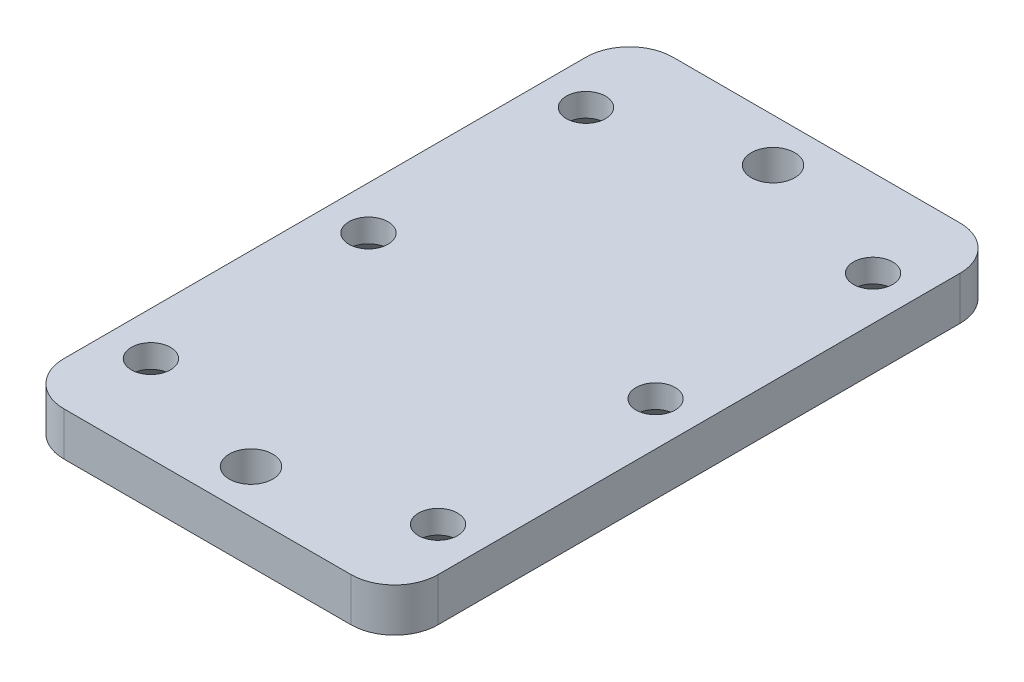
ISO-10303-21;
HEADER;
FILE_DESCRIPTION(('STEP AP214'),'2;1');
FILE_NAME('part.step','',(''),(''),'','','');
FILE_SCHEMA(('AUTOMOTIVE_DESIGN { 1 0 10303 214 1 1 1 1 }'));
ENDSEC;
DATA;
#1=APPLICATION_CONTEXT('core data for automotive mechanical design processes');
#2=APPLICATION_PROTOCOL_DEFINITION('international standard','automotive_design',2000,#1);
#3=PRODUCT_CONTEXT('',#1,'mechanical');
#4=PRODUCT('Part','Part','',(#3));
#5=PRODUCT_RELATED_PRODUCT_CATEGORY('part','',(#4));
#6=PRODUCT_DEFINITION_FORMATION('','',#4);
#7=PRODUCT_DEFINITION_CONTEXT('part definition',#1,'design');
#8=PRODUCT_DEFINITION('design','',#6,#7);
#9=PRODUCT_DEFINITION_SHAPE('','',#8);
#10=(LENGTH_UNIT() NAMED_UNIT(*) SI_UNIT(.MILLI.,.METRE.));
#11=(NAMED_UNIT(*) PLANE_ANGLE_UNIT() SI_UNIT($,.RADIAN.));
#12=(NAMED_UNIT(*) SI_UNIT($,.STERADIAN.) SOLID_ANGLE_UNIT());
#13=UNCERTAINTY_MEASURE_WITH_UNIT(LENGTH_MEASURE(1.E-05),#10,'distance_accuracy_value','');
#14=(GEOMETRIC_REPRESENTATION_CONTEXT(3) GLOBAL_UNCERTAINTY_ASSIGNED_CONTEXT((#13)) GLOBAL_UNIT_ASSIGNED_CONTEXT((#10,
#11,#12)) REPRESENTATION_CONTEXT('',''));
#15=CARTESIAN_POINT('',(0.,0.,0.));
#16=DIRECTION('',(0.,0.,1.));
#17=DIRECTION('',(1.,0.,0.));
#18=AXIS2_PLACEMENT_3D('',#15,#16,#17);
#19=CARTESIAN_POINT('',(-16.5,5.,30.));
#20=DIRECTION('',(0.,-1.,0.));
#21=DIRECTION('',(0.,0.,-1.));
#22=AXIS2_PLACEMENT_3D('',#19,#20,#21);
#23=PLANE('',#22);
#24=CARTESIAN_POINT('',(16.5,5.,-25.));
#25=DIRECTION('',(0.,-1.,0.));
#26=DIRECTION('',(0.,0.,-1.));
#27=AXIS2_PLACEMENT_3D('',#24,#25,#26);
#28=CIRCLE('',#27,2.25);
#29=CARTESIAN_POINT('',(16.5,5.,-27.25));
#30=VERTEX_POINT('',#29);
#31=EDGE_CURVE('E257',#30,#30,#28,.T.);
#32=ORIENTED_EDGE('',*,*,#31,.T.);
#33=EDGE_LOOP('',(#32));
#34=FACE_BOUND('',#33,.T.);
#35=CARTESIAN_POINT('',(16.5,5.,0.));
#36=DIRECTION('',(0.,-1.,0.));
#37=DIRECTION('',(0.,0.,-1.));
#38=AXIS2_PLACEMENT_3D('',#35,#36,#37);
#39=CIRCLE('',#38,2.25);
#40=CARTESIAN_POINT('',(16.5,5.,-2.25));
#41=VERTEX_POINT('',#40);
#42=EDGE_CURVE('E248',#41,#41,#39,.T.);
#43=ORIENTED_EDGE('',*,*,#42,.T.);
#44=EDGE_LOOP('',(#43));
#45=FACE_BOUND('',#44,.T.);
#46=CARTESIAN_POINT('',(16.5,5.,25.));
#47=DIRECTION('',(0.,-1.,0.));
#48=DIRECTION('',(0.,0.,-1.));
#49=AXIS2_PLACEMENT_3D('',#46,#47,#48);
#50=CIRCLE('',#49,2.25);
#51=CARTESIAN_POINT('',(16.5,5.,22.75));
#52=VERTEX_POINT('',#51);
#53=EDGE_CURVE('E239',#52,#52,#50,.T.);
#54=ORIENTED_EDGE('',*,*,#53,.T.);
#55=EDGE_LOOP('',(#54));
#56=FACE_BOUND('',#55,.T.);
#57=CARTESIAN_POINT('',(-16.5,5.,25.));
#58=DIRECTION('',(0.,-1.,0.));
#59=DIRECTION('',(0.,0.,-1.));
#60=AXIS2_PLACEMENT_3D('',#57,#58,#59);
#61=CIRCLE('',#60,2.25);
#62=CARTESIAN_POINT('',(-16.5,5.,22.75));
#63=VERTEX_POINT('',#62);
#64=EDGE_CURVE('E230',#63,#63,#61,.T.);
#65=ORIENTED_EDGE('',*,*,#64,.T.);
#66=EDGE_LOOP('',(#65));
#67=FACE_BOUND('',#66,.T.);
#68=CARTESIAN_POINT('',(-16.5,5.,0.));
#69=DIRECTION('',(0.,-1.,0.));
#70=DIRECTION('',(0.,0.,-1.));
#71=AXIS2_PLACEMENT_3D('',#68,#69,#70);
#72=CIRCLE('',#71,2.25);
#73=CARTESIAN_POINT('',(-16.5,5.,-2.25));
#74=VERTEX_POINT('',#73);
#75=EDGE_CURVE('E221',#74,#74,#72,.T.);
#76=ORIENTED_EDGE('',*,*,#75,.T.);
#77=EDGE_LOOP('',(#76));
#78=FACE_BOUND('',#77,.T.);
#79=CARTESIAN_POINT('',(-16.5,5.,-25.));
#80=DIRECTION('',(0.,-1.,0.));
#81=DIRECTION('',(0.,0.,-1.));
#82=AXIS2_PLACEMENT_3D('',#79,#80,#81);
#83=CIRCLE('',#82,2.25);
#84=CARTESIAN_POINT('',(-16.5,5.,-27.25));
#85=VERTEX_POINT('',#84);
#86=EDGE_CURVE('E212',#85,#85,#83,.T.);
#87=ORIENTED_EDGE('',*,*,#86,.T.);
#88=EDGE_LOOP('',(#87));
#89=FACE_BOUND('',#88,.T.);
#90=CARTESIAN_POINT('',(0.,5.,-30.));
#91=DIRECTION('',(0.,-1.,0.));
#92=DIRECTION('',(0.,0.,-1.));
#93=AXIS2_PLACEMENT_3D('',#90,#91,#92);
#94=CIRCLE('',#93,2.5);
#95=CARTESIAN_POINT('',(0.,5.,-32.5));
#96=VERTEX_POINT('',#95);
#97=EDGE_CURVE('E203',#96,#96,#94,.T.);
#98=ORIENTED_EDGE('',*,*,#97,.T.);
#99=EDGE_LOOP('',(#98));
#100=FACE_BOUND('',#99,.T.);
#101=CARTESIAN_POINT('',(0.,5.,30.));
#102=DIRECTION('',(0.,-1.,0.));
#103=DIRECTION('',(0.,0.,-1.));
#104=AXIS2_PLACEMENT_3D('',#101,#102,#103);
#105=CIRCLE('',#104,2.5);
#106=CARTESIAN_POINT('',(0.,5.,27.5));
#107=VERTEX_POINT('',#106);
#108=EDGE_CURVE('E151',#107,#107,#105,.T.);
#109=ORIENTED_EDGE('',*,*,#108,.T.);
#110=EDGE_LOOP('',(#109));
#111=FACE_BOUND('',#110,.T.);
#112=CARTESIAN_POINT('',(-16.5,5.,30.));
#113=DIRECTION('',(0.,1.,0.));
#114=DIRECTION('',(0.,0.,-1.));
#115=AXIS2_PLACEMENT_3D('',#112,#113,#114);
#116=CIRCLE('',#115,5.);
#117=CARTESIAN_POINT('',(-21.5,5.,30.));
#118=VERTEX_POINT('',#117);
#119=CARTESIAN_POINT('',(-16.5,5.,35.));
#120=VERTEX_POINT('',#119);
#121=EDGE_CURVE('E162',#118,#120,#116,.T.);
#122=ORIENTED_EDGE('',*,*,#121,.T.);
#123=DIRECTION('',(1.,0.,0.));
#124=VECTOR('',#123,1.);
#125=CARTESIAN_POINT('',(-16.5,5.,35.));
#126=LINE('',#125,#124);
#127=CARTESIAN_POINT('',(16.5,5.,35.));
#128=VERTEX_POINT('',#127);
#129=EDGE_CURVE('E111',#120,#128,#126,.T.);
#130=ORIENTED_EDGE('',*,*,#129,.T.);
#131=CARTESIAN_POINT('',(16.5,5.,30.));
#132=DIRECTION('',(0.,1.,0.));
#133=DIRECTION('',(0.,0.,1.));
#134=AXIS2_PLACEMENT_3D('',#131,#132,#133);
#135=CIRCLE('',#134,5.);
#136=CARTESIAN_POINT('',(21.5,5.,30.));
#137=VERTEX_POINT('',#136);
#138=EDGE_CURVE('E177',#128,#137,#135,.T.);
#139=ORIENTED_EDGE('',*,*,#138,.T.);
#140=DIRECTION('',(0.,0.,-1.));
#141=VECTOR('',#140,1.);
#142=CARTESIAN_POINT('',(21.5,5.,30.));
#143=LINE('',#142,#141);
#144=CARTESIAN_POINT('',(21.5,5.,-30.));
#145=VERTEX_POINT('',#144);
#146=EDGE_CURVE('E189',#137,#145,#143,.T.);
#147=ORIENTED_EDGE('',*,*,#146,.T.);
#148=CARTESIAN_POINT('',(16.5,5.,-30.));
#149=DIRECTION('',(0.,1.,0.));
#150=DIRECTION('',(0.,0.,-1.));
#151=AXIS2_PLACEMENT_3D('',#148,#149,#150);
#152=CIRCLE('',#151,5.);
#153=CARTESIAN_POINT('',(16.5,5.,-35.));
#154=VERTEX_POINT('',#153);
#155=EDGE_CURVE('E129',#145,#154,#152,.T.);
#156=ORIENTED_EDGE('',*,*,#155,.T.);
#157=DIRECTION('',(-1.,0.,0.));
#158=VECTOR('',#157,1.);
#159=CARTESIAN_POINT('',(-16.5,5.,-35.));
#160=LINE('',#159,#158);
#161=CARTESIAN_POINT('',(-16.5,5.,-35.));
#162=VERTEX_POINT('',#161);
#163=EDGE_CURVE('E124',#154,#162,#160,.T.);
#164=ORIENTED_EDGE('',*,*,#163,.T.);
#165=CARTESIAN_POINT('',(-16.5,5.,-30.));
#166=DIRECTION('',(0.,1.,0.));
#167=DIRECTION('',(0.,0.,-1.));
#168=AXIS2_PLACEMENT_3D('',#165,#166,#167);
#169=CIRCLE('',#168,5.);
#170=CARTESIAN_POINT('',(-21.5,5.,-30.));
#171=VERTEX_POINT('',#170);
#172=EDGE_CURVE('E127',#162,#171,#169,.T.);
#173=ORIENTED_EDGE('',*,*,#172,.T.);
#174=DIRECTION('',(0.,0.,1.));
#175=VECTOR('',#174,1.);
#176=CARTESIAN_POINT('',(-21.5,5.,30.));
#177=LINE('',#176,#175);
#178=EDGE_CURVE('E68',#171,#118,#177,.T.);
#179=ORIENTED_EDGE('',*,*,#178,.T.);
#180=EDGE_LOOP('',(#122,#130,#139,#147,#156,#164,#173,#179));
#181=FACE_BOUND('',#180,.T.);
#182=ADVANCED_FACE('F51',(#34,#45,#56,#67,#78,#89,#100,#111,#181),#23,.F.);
#183=CARTESIAN_POINT('',(-16.5,0.,30.));
#184=DIRECTION('',(0.,-1.,0.));
#185=DIRECTION('',(0.,0.,-1.));
#186=AXIS2_PLACEMENT_3D('',#183,#184,#185);
#187=PLANE('',#186);
#188=CARTESIAN_POINT('',(16.5,0.,-25.));
#189=DIRECTION('',(0.,-1.,0.));
#190=DIRECTION('',(0.,0.,-1.));
#191=AXIS2_PLACEMENT_3D('',#188,#189,#190);
#192=CIRCLE('',#191,4.59);
#193=CARTESIAN_POINT('',(16.5,0.,-29.59));
#194=VERTEX_POINT('',#193);
#195=EDGE_CURVE('E263',#194,#194,#192,.T.);
#196=ORIENTED_EDGE('',*,*,#195,.F.);
#197=EDGE_LOOP('',(#196));
#198=FACE_BOUND('',#197,.T.);
#199=CARTESIAN_POINT('',(16.5,0.,0.));
#200=DIRECTION('',(0.,-1.,0.));
#201=DIRECTION('',(0.,0.,-1.));
#202=AXIS2_PLACEMENT_3D('',#199,#200,#201);
#203=CIRCLE('',#202,4.59);
#204=CARTESIAN_POINT('',(16.5,0.,-4.59));
#205=VERTEX_POINT('',#204);
#206=EDGE_CURVE('E254',#205,#205,#203,.T.);
#207=ORIENTED_EDGE('',*,*,#206,.F.);
#208=EDGE_LOOP('',(#207));
#209=FACE_BOUND('',#208,.T.);
#210=CARTESIAN_POINT('',(16.5,0.,25.));
#211=DIRECTION('',(0.,-1.,0.));
#212=DIRECTION('',(0.,0.,-1.));
#213=AXIS2_PLACEMENT_3D('',#210,#211,#212);
#214=CIRCLE('',#213,4.59);
#215=CARTESIAN_POINT('',(16.5,0.,20.41));
#216=VERTEX_POINT('',#215);
#217=EDGE_CURVE('E245',#216,#216,#214,.T.);
#218=ORIENTED_EDGE('',*,*,#217,.F.);
#219=EDGE_LOOP('',(#218));
#220=FACE_BOUND('',#219,.T.);
#221=CARTESIAN_POINT('',(-16.5,0.,25.));
#222=DIRECTION('',(0.,-1.,0.));
#223=DIRECTION('',(0.,0.,-1.));
#224=AXIS2_PLACEMENT_3D('',#221,#222,#223);
#225=CIRCLE('',#224,4.59);
#226=CARTESIAN_POINT('',(-16.5,0.,20.41));
#227=VERTEX_POINT('',#226);
#228=EDGE_CURVE('E236',#227,#227,#225,.T.);
#229=ORIENTED_EDGE('',*,*,#228,.F.);
#230=EDGE_LOOP('',(#229));
#231=FACE_BOUND('',#230,.T.);
#232=CARTESIAN_POINT('',(-16.5,0.,0.));
#233=DIRECTION('',(0.,-1.,0.));
#234=DIRECTION('',(0.,0.,-1.));
#235=AXIS2_PLACEMENT_3D('',#232,#233,#234);
#236=CIRCLE('',#235,4.59);
#237=CARTESIAN_POINT('',(-16.5,0.,-4.59));
#238=VERTEX_POINT('',#237);
#239=EDGE_CURVE('E227',#238,#238,#236,.T.);
#240=ORIENTED_EDGE('',*,*,#239,.F.);
#241=EDGE_LOOP('',(#240));
#242=FACE_BOUND('',#241,.T.);
#243=CARTESIAN_POINT('',(-16.5,0.,-25.));
#244=DIRECTION('',(0.,-1.,0.));
#245=DIRECTION('',(0.,0.,-1.));
#246=AXIS2_PLACEMENT_3D('',#243,#244,#245);
#247=CIRCLE('',#246,4.59);
#248=CARTESIAN_POINT('',(-16.5,0.,-29.59));
#249=VERTEX_POINT('',#248);
#250=EDGE_CURVE('E218',#249,#249,#247,.T.);
#251=ORIENTED_EDGE('',*,*,#250,.F.);
#252=EDGE_LOOP('',(#251));
#253=FACE_BOUND('',#252,.T.);
#254=CARTESIAN_POINT('',(0.,0.,-30.));
#255=DIRECTION('',(0.,-1.,0.));
#256=DIRECTION('',(0.,0.,-1.));
#257=AXIS2_PLACEMENT_3D('',#254,#255,#256);
#258=CIRCLE('',#257,3.5);
#259=CARTESIAN_POINT('',(0.,0.,-33.5));
#260=VERTEX_POINT('',#259);
#261=EDGE_CURVE('E209',#260,#260,#258,.T.);
#262=ORIENTED_EDGE('',*,*,#261,.F.);
#263=EDGE_LOOP('',(#262));
#264=FACE_BOUND('',#263,.T.);
#265=CARTESIAN_POINT('',(0.,0.,30.));
#266=DIRECTION('',(0.,-1.,0.));
#267=DIRECTION('',(0.,0.,-1.));
#268=AXIS2_PLACEMENT_3D('',#265,#266,#267);
#269=CIRCLE('',#268,3.5);
#270=CARTESIAN_POINT('',(0.,0.,26.5));
#271=VERTEX_POINT('',#270);
#272=EDGE_CURVE('E200',#271,#271,#269,.T.);
#273=ORIENTED_EDGE('',*,*,#272,.F.);
#274=EDGE_LOOP('',(#273));
#275=FACE_BOUND('',#274,.T.);
#276=CARTESIAN_POINT('',(-16.5,0.,30.));
#277=DIRECTION('',(0.,1.,0.));
#278=DIRECTION('',(0.,0.,-1.));
#279=AXIS2_PLACEMENT_3D('',#276,#277,#278);
#280=CIRCLE('',#279,5.);
#281=CARTESIAN_POINT('',(-21.5,0.,30.));
#282=VERTEX_POINT('',#281);
#283=CARTESIAN_POINT('',(-16.5,0.,35.));
#284=VERTEX_POINT('',#283);
#285=EDGE_CURVE('E147',#282,#284,#280,.T.);
#286=ORIENTED_EDGE('',*,*,#285,.F.);
#287=DIRECTION('',(0.,0.,1.));
#288=VECTOR('',#287,1.);
#289=CARTESIAN_POINT('',(-21.5,0.,30.));
#290=LINE('',#289,#288);
#291=CARTESIAN_POINT('',(-21.5,0.,-30.));
#292=VERTEX_POINT('',#291);
#293=EDGE_CURVE('E103',#292,#282,#290,.T.);
#294=ORIENTED_EDGE('',*,*,#293,.F.);
#295=CARTESIAN_POINT('',(-16.5,0.,-30.));
#296=DIRECTION('',(0.,1.,0.));
#297=DIRECTION('',(0.,0.,-1.));
#298=AXIS2_PLACEMENT_3D('',#295,#296,#297);
#299=CIRCLE('',#298,5.);
#300=CARTESIAN_POINT('',(-16.5,0.,-35.));
#301=VERTEX_POINT('',#300);
#302=EDGE_CURVE('E97',#301,#292,#299,.T.);
#303=ORIENTED_EDGE('',*,*,#302,.F.);
#304=DIRECTION('',(-1.,0.,0.));
#305=VECTOR('',#304,1.);
#306=CARTESIAN_POINT('',(-16.5,0.,-35.));
#307=LINE('',#306,#305);
#308=CARTESIAN_POINT('',(16.5,0.,-35.));
#309=VERTEX_POINT('',#308);
#310=EDGE_CURVE('E137',#309,#301,#307,.T.);
#311=ORIENTED_EDGE('',*,*,#310,.F.);
#312=CARTESIAN_POINT('',(16.5,0.,-30.));
#313=DIRECTION('',(0.,1.,0.));
#314=DIRECTION('',(0.,0.,-1.));
#315=AXIS2_PLACEMENT_3D('',#312,#313,#314);
#316=CIRCLE('',#315,5.);
#317=CARTESIAN_POINT('',(21.5,0.,-30.));
#318=VERTEX_POINT('',#317);
#319=EDGE_CURVE('E157',#318,#309,#316,.T.);
#320=ORIENTED_EDGE('',*,*,#319,.F.);
#321=DIRECTION('',(0.,0.,-1.));
#322=VECTOR('',#321,1.);
#323=CARTESIAN_POINT('',(21.5,0.,30.));
#324=LINE('',#323,#322);
#325=CARTESIAN_POINT('',(21.5,0.,30.));
#326=VERTEX_POINT('',#325);
#327=EDGE_CURVE('E155',#326,#318,#324,.T.);
#328=ORIENTED_EDGE('',*,*,#327,.F.);
#329=CARTESIAN_POINT('',(16.5,0.,30.));
#330=DIRECTION('',(0.,1.,0.));
#331=DIRECTION('',(0.,0.,1.));
#332=AXIS2_PLACEMENT_3D('',#329,#330,#331);
#333=CIRCLE('',#332,5.);
#334=CARTESIAN_POINT('',(16.5,0.,35.));
#335=VERTEX_POINT('',#334);
#336=EDGE_CURVE('E153',#335,#326,#333,.T.);
#337=ORIENTED_EDGE('',*,*,#336,.F.);
#338=DIRECTION('',(1.,0.,0.));
#339=VECTOR('',#338,1.);
#340=CARTESIAN_POINT('',(-16.5,0.,35.));
#341=LINE('',#340,#339);
#342=EDGE_CURVE('E150',#284,#335,#341,.T.);
#343=ORIENTED_EDGE('',*,*,#342,.F.);
#344=EDGE_LOOP('',(#286,#294,#303,#311,#320,#328,#337,#343));
#345=FACE_BOUND('',#344,.T.);
#346=ADVANCED_FACE('F181',(#198,#209,#220,#231,#242,#253,#264,#275,#345),#187,.T.);
#347=CARTESIAN_POINT('',(-16.5,5.,30.));
#348=DIRECTION('',(0.,-1.,0.));
#349=DIRECTION('',(0.,0.,-1.));
#350=AXIS2_PLACEMENT_3D('',#347,#348,#349);
#351=CYLINDRICAL_SURFACE('',#350,5.);
#352=ORIENTED_EDGE('',*,*,#285,.T.);
#353=DIRECTION('',(0.,-1.,0.));
#354=VECTOR('',#353,1.);
#355=CARTESIAN_POINT('',(-16.5,5.,35.));
#356=LINE('',#355,#354);
#357=EDGE_CURVE('E11',#120,#284,#356,.T.);
#358=ORIENTED_EDGE('',*,*,#357,.F.);
#359=ORIENTED_EDGE('',*,*,#121,.F.);
#360=DIRECTION('',(0.,-1.,0.));
#361=VECTOR('',#360,1.);
#362=CARTESIAN_POINT('',(-21.5,5.,30.));
#363=LINE('',#362,#361);
#364=EDGE_CURVE('E143',#118,#282,#363,.T.);
#365=ORIENTED_EDGE('',*,*,#364,.T.);
#366=EDGE_LOOP('',(#352,#358,#359,#365));
#367=FACE_BOUND('',#366,.T.);
#368=ADVANCED_FACE('F53',(#367),#351,.T.);
#369=CARTESIAN_POINT('',(-16.5,5.,35.));
#370=DIRECTION('',(0.,0.,-1.));
#371=DIRECTION('',(-1.,0.,0.));
#372=AXIS2_PLACEMENT_3D('',#369,#370,#371);
#373=PLANE('',#372);
#374=ORIENTED_EDGE('',*,*,#342,.T.);
#375=DIRECTION('',(0.,-1.,0.));
#376=VECTOR('',#375,1.);
#377=CARTESIAN_POINT('',(16.5,5.,35.));
#378=LINE('',#377,#376);
#379=EDGE_CURVE('E60',#128,#335,#378,.T.);
#380=ORIENTED_EDGE('',*,*,#379,.F.);
#381=ORIENTED_EDGE('',*,*,#129,.F.);
#382=ORIENTED_EDGE('',*,*,#357,.T.);
#383=EDGE_LOOP('',(#374,#380,#381,#382));
#384=FACE_BOUND('',#383,.T.);
#385=ADVANCED_FACE('F323',(#384),#373,.F.);
#386=CARTESIAN_POINT('',(16.5,5.,30.));
#387=DIRECTION('',(0.,-1.,0.));
#388=DIRECTION('',(0.,0.,-1.));
#389=AXIS2_PLACEMENT_3D('',#386,#387,#388);
#390=CYLINDRICAL_SURFACE('',#389,5.);
#391=ORIENTED_EDGE('',*,*,#336,.T.);
#392=DIRECTION('',(0.,-1.,0.));
#393=VECTOR('',#392,1.);
#394=CARTESIAN_POINT('',(21.5,5.,30.));
#395=LINE('',#394,#393);
#396=EDGE_CURVE('E169',#137,#326,#395,.T.);
#397=ORIENTED_EDGE('',*,*,#396,.F.);
#398=ORIENTED_EDGE('',*,*,#138,.F.);
#399=ORIENTED_EDGE('',*,*,#379,.T.);
#400=EDGE_LOOP('',(#391,#397,#398,#399));
#401=FACE_BOUND('',#400,.T.);
#402=ADVANCED_FACE('F175',(#401),#390,.T.);
#403=CARTESIAN_POINT('',(21.5,5.,30.));
#404=DIRECTION('',(-1.,0.,0.));
#405=DIRECTION('',(0.,0.,1.));
#406=AXIS2_PLACEMENT_3D('',#403,#404,#405);
#407=PLANE('',#406);
#408=ORIENTED_EDGE('',*,*,#327,.T.);
#409=DIRECTION('',(0.,-1.,0.));
#410=VECTOR('',#409,1.);
#411=CARTESIAN_POINT('',(21.5,5.,-30.));
#412=LINE('',#411,#410);
#413=EDGE_CURVE('E166',#145,#318,#412,.T.);
#414=ORIENTED_EDGE('',*,*,#413,.F.);
#415=ORIENTED_EDGE('',*,*,#146,.F.);
#416=ORIENTED_EDGE('',*,*,#396,.T.);
#417=EDGE_LOOP('',(#408,#414,#415,#416));
#418=FACE_BOUND('',#417,.T.);
#419=ADVANCED_FACE('F185',(#418),#407,.F.);
#420=CARTESIAN_POINT('',(16.5,5.,-30.));
#421=DIRECTION('',(0.,-1.,0.));
#422=DIRECTION('',(0.,0.,-1.));
#423=AXIS2_PLACEMENT_3D('',#420,#421,#422);
#424=CYLINDRICAL_SURFACE('',#423,5.);
#425=ORIENTED_EDGE('',*,*,#319,.T.);
#426=DIRECTION('',(0.,-1.,0.));
#427=VECTOR('',#426,1.);
#428=CARTESIAN_POINT('',(16.5,5.,-35.));
#429=LINE('',#428,#427);
#430=EDGE_CURVE('E138',#154,#309,#429,.T.);
#431=ORIENTED_EDGE('',*,*,#430,.F.);
#432=ORIENTED_EDGE('',*,*,#155,.F.);
#433=ORIENTED_EDGE('',*,*,#413,.T.);
#434=EDGE_LOOP('',(#425,#431,#432,#433));
#435=FACE_BOUND('',#434,.T.);
#436=ADVANCED_FACE('F188',(#435),#424,.T.);
#437=CARTESIAN_POINT('',(-16.5,5.,-35.));
#438=DIRECTION('',(0.,0.,1.));
#439=DIRECTION('',(1.,0.,0.));
#440=AXIS2_PLACEMENT_3D('',#437,#438,#439);
#441=PLANE('',#440);
#442=ORIENTED_EDGE('',*,*,#310,.T.);
#443=DIRECTION('',(0.,-1.,0.));
#444=VECTOR('',#443,1.);
#445=CARTESIAN_POINT('',(-16.5,5.,-35.));
#446=LINE('',#445,#444);
#447=EDGE_CURVE('E134',#162,#301,#446,.T.);
#448=ORIENTED_EDGE('',*,*,#447,.F.);
#449=ORIENTED_EDGE('',*,*,#163,.F.);
#450=ORIENTED_EDGE('',*,*,#430,.T.);
#451=EDGE_LOOP('',(#442,#448,#449,#450));
#452=FACE_BOUND('',#451,.T.);
#453=ADVANCED_FACE('F135',(#452),#441,.F.);
#454=CARTESIAN_POINT('',(-16.5,5.,-30.));
#455=DIRECTION('',(0.,-1.,0.));
#456=DIRECTION('',(0.,0.,-1.));
#457=AXIS2_PLACEMENT_3D('',#454,#455,#456);
#458=CYLINDRICAL_SURFACE('',#457,5.);
#459=ORIENTED_EDGE('',*,*,#302,.T.);
#460=DIRECTION('',(0.,-1.,0.));
#461=VECTOR('',#460,1.);
#462=CARTESIAN_POINT('',(-21.5,5.,-30.));
#463=LINE('',#462,#461);
#464=EDGE_CURVE('E139',#171,#292,#463,.T.);
#465=ORIENTED_EDGE('',*,*,#464,.F.);
#466=ORIENTED_EDGE('',*,*,#172,.F.);
#467=ORIENTED_EDGE('',*,*,#447,.T.);
#468=EDGE_LOOP('',(#459,#465,#466,#467));
#469=FACE_BOUND('',#468,.T.);
#470=ADVANCED_FACE('F141',(#469),#458,.T.);
#471=CARTESIAN_POINT('',(-21.5,5.,30.));
#472=DIRECTION('',(1.,0.,0.));
#473=DIRECTION('',(0.,0.,-1.));
#474=AXIS2_PLACEMENT_3D('',#471,#472,#473);
#475=PLANE('',#474);
#476=ORIENTED_EDGE('',*,*,#293,.T.);
#477=ORIENTED_EDGE('',*,*,#364,.F.);
#478=ORIENTED_EDGE('',*,*,#178,.F.);
#479=ORIENTED_EDGE('',*,*,#464,.T.);
#480=EDGE_LOOP('',(#476,#477,#478,#479));
#481=FACE_BOUND('',#480,.T.);
#482=ADVANCED_FACE('F300',(#481),#475,.F.);
#483=CARTESIAN_POINT('',(0.,0.,30.));
#484=DIRECTION('',(0.,-1.,0.));
#485=DIRECTION('',(0.,0.,-1.));
#486=AXIS2_PLACEMENT_3D('',#483,#484,#485);
#487=CYLINDRICAL_SURFACE('',#486,2.5);
#488=ORIENTED_EDGE('',*,*,#108,.F.);
#489=EDGE_LOOP('',(#488));
#490=FACE_BOUND('',#489,.T.);
#491=CARTESIAN_POINT('',(0.,0.999999999999999,30.));
#492=DIRECTION('',(0.,-1.,0.));
#493=DIRECTION('',(0.,0.,-1.));
#494=AXIS2_PLACEMENT_3D('',#491,#492,#493);
#495=CIRCLE('',#494,2.5);
#496=CARTESIAN_POINT('',(0.,0.999999999999999,27.5));
#497=VERTEX_POINT('',#496);
#498=EDGE_CURVE('E197',#497,#497,#495,.T.);
#499=ORIENTED_EDGE('',*,*,#498,.T.);
#500=EDGE_LOOP('',(#499));
#501=FACE_BOUND('',#500,.T.);
#502=ADVANCED_FACE('F289',(#490,#501),#487,.F.);
#503=CARTESIAN_POINT('',(0.,0.,30.));
#504=DIRECTION('',(0.,-1.,0.));
#505=DIRECTION('',(0.,0.,-1.));
#506=AXIS2_PLACEMENT_3D('',#503,#504,#505);
#507=CONICAL_SURFACE('',#506,3.5,0.785398163397449);
#508=ORIENTED_EDGE('',*,*,#498,.F.);
#509=EDGE_LOOP('',(#508));
#510=FACE_BOUND('',#509,.T.);
#511=ORIENTED_EDGE('',*,*,#272,.T.);
#512=EDGE_LOOP('',(#511));
#513=FACE_BOUND('',#512,.T.);
#514=ADVANCED_FACE('F286',(#510,#513),#507,.F.);
#515=CARTESIAN_POINT('',(0.,0.,-30.));
#516=DIRECTION('',(0.,-1.,0.));
#517=DIRECTION('',(0.,0.,-1.));
#518=AXIS2_PLACEMENT_3D('',#515,#516,#517);
#519=CYLINDRICAL_SURFACE('',#518,2.5);
#520=ORIENTED_EDGE('',*,*,#97,.F.);
#521=EDGE_LOOP('',(#520));
#522=FACE_BOUND('',#521,.T.);
#523=CARTESIAN_POINT('',(0.,0.999999999999999,-30.));
#524=DIRECTION('',(0.,-1.,0.));
#525=DIRECTION('',(0.,0.,-1.));
#526=AXIS2_PLACEMENT_3D('',#523,#524,#525);
#527=CIRCLE('',#526,2.5);
#528=CARTESIAN_POINT('',(0.,0.999999999999999,-32.5));
#529=VERTEX_POINT('',#528);
#530=EDGE_CURVE('E206',#529,#529,#527,.T.);
#531=ORIENTED_EDGE('',*,*,#530,.T.);
#532=EDGE_LOOP('',(#531));
#533=FACE_BOUND('',#532,.T.);
#534=ADVANCED_FACE('F288',(#522,#533),#519,.F.);
#535=CARTESIAN_POINT('',(0.,0.,-30.));
#536=DIRECTION('',(0.,-1.,0.));
#537=DIRECTION('',(0.,0.,-1.));
#538=AXIS2_PLACEMENT_3D('',#535,#536,#537);
#539=CONICAL_SURFACE('',#538,3.5,0.785398163397449);
#540=ORIENTED_EDGE('',*,*,#530,.F.);
#541=EDGE_LOOP('',(#540));
#542=FACE_BOUND('',#541,.T.);
#543=ORIENTED_EDGE('',*,*,#261,.T.);
#544=EDGE_LOOP('',(#543));
#545=FACE_BOUND('',#544,.T.);
#546=ADVANCED_FACE('F296',(#542,#545),#539,.F.);
#547=CARTESIAN_POINT('',(-16.5,0.,-25.));
#548=DIRECTION('',(0.,-1.,0.));
#549=DIRECTION('',(0.,0.,-1.));
#550=AXIS2_PLACEMENT_3D('',#547,#548,#549);
#551=CYLINDRICAL_SURFACE('',#550,2.25);
#552=ORIENTED_EDGE('',*,*,#86,.F.);
#553=EDGE_LOOP('',(#552));
#554=FACE_BOUND('',#553,.T.);
#555=CARTESIAN_POINT('',(-16.5,2.34,-25.));
#556=DIRECTION('',(0.,-1.,0.));
#557=DIRECTION('',(0.,0.,-1.));
#558=AXIS2_PLACEMENT_3D('',#555,#556,#557);
#559=CIRCLE('',#558,2.25);
#560=CARTESIAN_POINT('',(-16.5,2.34,-27.25));
#561=VERTEX_POINT('',#560);
#562=EDGE_CURVE('E215',#561,#561,#559,.T.);
#563=ORIENTED_EDGE('',*,*,#562,.T.);
#564=EDGE_LOOP('',(#563));
#565=FACE_BOUND('',#564,.T.);
#566=ADVANCED_FACE('F409',(#554,#565),#551,.F.);
#567=CARTESIAN_POINT('',(-16.5,0.,-25.));
#568=DIRECTION('',(0.,-1.,0.));
#569=DIRECTION('',(0.,0.,-1.));
#570=AXIS2_PLACEMENT_3D('',#567,#568,#569);
#571=CONICAL_SURFACE('',#570,4.59,0.785398163397448);
#572=ORIENTED_EDGE('',*,*,#562,.F.);
#573=EDGE_LOOP('',(#572));
#574=FACE_BOUND('',#573,.T.);
#575=ORIENTED_EDGE('',*,*,#250,.T.);
#576=EDGE_LOOP('',(#575));
#577=FACE_BOUND('',#576,.T.);
#578=ADVANCED_FACE('F420',(#574,#577),#571,.F.);
#579=CARTESIAN_POINT('',(-16.5,0.,0.));
#580=DIRECTION('',(0.,-1.,0.));
#581=DIRECTION('',(0.,0.,-1.));
#582=AXIS2_PLACEMENT_3D('',#579,#580,#581);
#583=CYLINDRICAL_SURFACE('',#582,2.25);
#584=ORIENTED_EDGE('',*,*,#75,.F.);
#585=EDGE_LOOP('',(#584));
#586=FACE_BOUND('',#585,.T.);
#587=CARTESIAN_POINT('',(-16.5,2.34,0.));
#588=DIRECTION('',(0.,-1.,0.));
#589=DIRECTION('',(0.,0.,-1.));
#590=AXIS2_PLACEMENT_3D('',#587,#588,#589);
#591=CIRCLE('',#590,2.25);
#592=CARTESIAN_POINT('',(-16.5,2.34,-2.25));
#593=VERTEX_POINT('',#592);
#594=EDGE_CURVE('E224',#593,#593,#591,.T.);
#595=ORIENTED_EDGE('',*,*,#594,.T.);
#596=EDGE_LOOP('',(#595));
#597=FACE_BOUND('',#596,.T.);
#598=ADVANCED_FACE('F430',(#586,#597),#583,.F.);
#599=CARTESIAN_POINT('',(-16.5,0.,0.));
#600=DIRECTION('',(0.,-1.,0.));
#601=DIRECTION('',(0.,0.,-1.));
#602=AXIS2_PLACEMENT_3D('',#599,#600,#601);
#603=CONICAL_SURFACE('',#602,4.59,0.785398163397448);
#604=ORIENTED_EDGE('',*,*,#594,.F.);
#605=EDGE_LOOP('',(#604));
#606=FACE_BOUND('',#605,.T.);
#607=ORIENTED_EDGE('',*,*,#239,.T.);
#608=EDGE_LOOP('',(#607));
#609=FACE_BOUND('',#608,.T.);
#610=ADVANCED_FACE('F440',(#606,#609),#603,.F.);
#611=CARTESIAN_POINT('',(-16.5,0.,25.));
#612=DIRECTION('',(0.,-1.,0.));
#613=DIRECTION('',(0.,0.,-1.));
#614=AXIS2_PLACEMENT_3D('',#611,#612,#613);
#615=CYLINDRICAL_SURFACE('',#614,2.25);
#616=ORIENTED_EDGE('',*,*,#64,.F.);
#617=EDGE_LOOP('',(#616));
#618=FACE_BOUND('',#617,.T.);
#619=CARTESIAN_POINT('',(-16.5,2.34,25.));
#620=DIRECTION('',(0.,-1.,0.));
#621=DIRECTION('',(0.,0.,-1.));
#622=AXIS2_PLACEMENT_3D('',#619,#620,#621);
#623=CIRCLE('',#622,2.25);
#624=CARTESIAN_POINT('',(-16.5,2.34,22.75));
#625=VERTEX_POINT('',#624);
#626=EDGE_CURVE('E233',#625,#625,#623,.T.);
#627=ORIENTED_EDGE('',*,*,#626,.T.);
#628=EDGE_LOOP('',(#627));
#629=FACE_BOUND('',#628,.T.);
#630=ADVANCED_FACE('F450',(#618,#629),#615,.F.);
#631=CARTESIAN_POINT('',(-16.5,0.,25.));
#632=DIRECTION('',(0.,-1.,0.));
#633=DIRECTION('',(0.,0.,-1.));
#634=AXIS2_PLACEMENT_3D('',#631,#632,#633);
#635=CONICAL_SURFACE('',#634,4.59,0.785398163397448);
#636=ORIENTED_EDGE('',*,*,#626,.F.);
#637=EDGE_LOOP('',(#636));
#638=FACE_BOUND('',#637,.T.);
#639=ORIENTED_EDGE('',*,*,#228,.T.);
#640=EDGE_LOOP('',(#639));
#641=FACE_BOUND('',#640,.T.);
#642=ADVANCED_FACE('F460',(#638,#641),#635,.F.);
#643=CARTESIAN_POINT('',(16.5,0.,25.));
#644=DIRECTION('',(0.,-1.,0.));
#645=DIRECTION('',(0.,0.,-1.));
#646=AXIS2_PLACEMENT_3D('',#643,#644,#645);
#647=CYLINDRICAL_SURFACE('',#646,2.25);
#648=ORIENTED_EDGE('',*,*,#53,.F.);
#649=EDGE_LOOP('',(#648));
#650=FACE_BOUND('',#649,.T.);
#651=CARTESIAN_POINT('',(16.5,2.34,25.));
#652=DIRECTION('',(0.,-1.,0.));
#653=DIRECTION('',(0.,0.,-1.));
#654=AXIS2_PLACEMENT_3D('',#651,#652,#653);
#655=CIRCLE('',#654,2.25);
#656=CARTESIAN_POINT('',(16.5,2.34,22.75));
#657=VERTEX_POINT('',#656);
#658=EDGE_CURVE('E242',#657,#657,#655,.T.);
#659=ORIENTED_EDGE('',*,*,#658,.T.);
#660=EDGE_LOOP('',(#659));
#661=FACE_BOUND('',#660,.T.);
#662=ADVANCED_FACE('F470',(#650,#661),#647,.F.);
#663=CARTESIAN_POINT('',(16.5,0.,25.));
#664=DIRECTION('',(0.,-1.,0.));
#665=DIRECTION('',(0.,0.,-1.));
#666=AXIS2_PLACEMENT_3D('',#663,#664,#665);
#667=CONICAL_SURFACE('',#666,4.59,0.785398163397449);
#668=ORIENTED_EDGE('',*,*,#658,.F.);
#669=EDGE_LOOP('',(#668));
#670=FACE_BOUND('',#669,.T.);
#671=ORIENTED_EDGE('',*,*,#217,.T.);
#672=EDGE_LOOP('',(#671));
#673=FACE_BOUND('',#672,.T.);
#674=ADVANCED_FACE('F480',(#670,#673),#667,.F.);
#675=CARTESIAN_POINT('',(16.5,0.,0.));
#676=DIRECTION('',(0.,-1.,0.));
#677=DIRECTION('',(0.,0.,-1.));
#678=AXIS2_PLACEMENT_3D('',#675,#676,#677);
#679=CYLINDRICAL_SURFACE('',#678,2.25);
#680=ORIENTED_EDGE('',*,*,#42,.F.);
#681=EDGE_LOOP('',(#680));
#682=FACE_BOUND('',#681,.T.);
#683=CARTESIAN_POINT('',(16.5,2.34,0.));
#684=DIRECTION('',(0.,-1.,0.));
#685=DIRECTION('',(0.,0.,-1.));
#686=AXIS2_PLACEMENT_3D('',#683,#684,#685);
#687=CIRCLE('',#686,2.25);
#688=CARTESIAN_POINT('',(16.5,2.34,-2.25));
#689=VERTEX_POINT('',#688);
#690=EDGE_CURVE('E251',#689,#689,#687,.T.);
#691=ORIENTED_EDGE('',*,*,#690,.T.);
#692=EDGE_LOOP('',(#691));
#693=FACE_BOUND('',#692,.T.);
#694=ADVANCED_FACE('F490',(#682,#693),#679,.F.);
#695=CARTESIAN_POINT('',(16.5,0.,0.));
#696=DIRECTION('',(0.,-1.,0.));
#697=DIRECTION('',(0.,0.,-1.));
#698=AXIS2_PLACEMENT_3D('',#695,#696,#697);
#699=CONICAL_SURFACE('',#698,4.59,0.785398163397449);
#700=ORIENTED_EDGE('',*,*,#690,.F.);
#701=EDGE_LOOP('',(#700));
#702=FACE_BOUND('',#701,.T.);
#703=ORIENTED_EDGE('',*,*,#206,.T.);
#704=EDGE_LOOP('',(#703));
#705=FACE_BOUND('',#704,.T.);
#706=ADVANCED_FACE('F500',(#702,#705),#699,.F.);
#707=CARTESIAN_POINT('',(16.5,0.,-25.));
#708=DIRECTION('',(0.,-1.,0.));
#709=DIRECTION('',(0.,0.,-1.));
#710=AXIS2_PLACEMENT_3D('',#707,#708,#709);
#711=CYLINDRICAL_SURFACE('',#710,2.25);
#712=ORIENTED_EDGE('',*,*,#31,.F.);
#713=EDGE_LOOP('',(#712));
#714=FACE_BOUND('',#713,.T.);
#715=CARTESIAN_POINT('',(16.5,2.34,-25.));
#716=DIRECTION('',(0.,-1.,0.));
#717=DIRECTION('',(0.,0.,-1.));
#718=AXIS2_PLACEMENT_3D('',#715,#716,#717);
#719=CIRCLE('',#718,2.25);
#720=CARTESIAN_POINT('',(16.5,2.34,-27.25));
#721=VERTEX_POINT('',#720);
#722=EDGE_CURVE('E260',#721,#721,#719,.T.);
#723=ORIENTED_EDGE('',*,*,#722,.T.);
#724=EDGE_LOOP('',(#723));
#725=FACE_BOUND('',#724,.T.);
#726=ADVANCED_FACE('F510',(#714,#725),#711,.F.);
#727=CARTESIAN_POINT('',(16.5,0.,-25.));
#728=DIRECTION('',(0.,-1.,0.));
#729=DIRECTION('',(0.,0.,-1.));
#730=AXIS2_PLACEMENT_3D('',#727,#728,#729);
#731=CONICAL_SURFACE('',#730,4.59,0.785398163397449);
#732=ORIENTED_EDGE('',*,*,#722,.F.);
#733=EDGE_LOOP('',(#732));
#734=FACE_BOUND('',#733,.T.);
#735=ORIENTED_EDGE('',*,*,#195,.T.);
#736=EDGE_LOOP('',(#735));
#737=FACE_BOUND('',#736,.T.);
#738=ADVANCED_FACE('F267',(#734,#737),#731,.F.);
#739=CLOSED_SHELL('',(#182,#346,#368,#385,#402,#419,#436,#453,#470,#482,#502,#514,#534,#546,
#566,#578,#598,#610,#630,#642,#662,#674,#694,#706,#726,#738));
#740=MANIFOLD_SOLID_BREP('B2',#739);
#741=ADVANCED_BREP_SHAPE_REPRESENTATION('',(#18,#740),#14);
#742=SHAPE_DEFINITION_REPRESENTATION(#9,#741);
ENDSEC;
END-ISO-10303-21;
